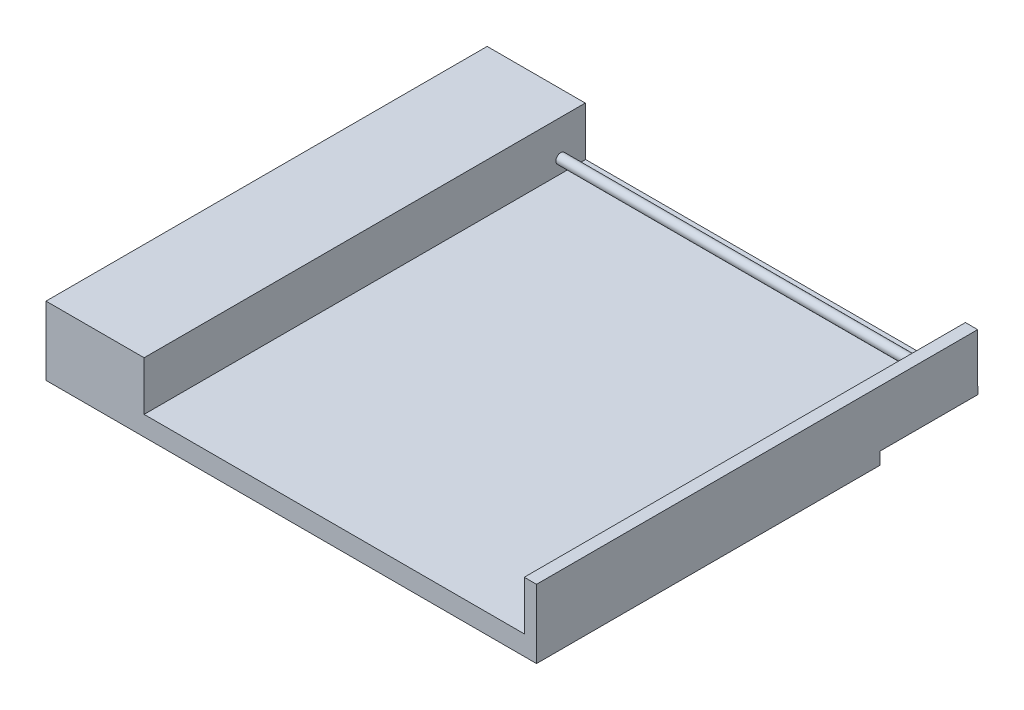
ISO-10303-21;
HEADER;
FILE_DESCRIPTION(('STEP AP214'),'2;1');
FILE_NAME('part.step','',(''),(''),'','','');
FILE_SCHEMA(('AUTOMOTIVE_DESIGN { 1 0 10303 214 1 1 1 1 }'));
ENDSEC;
DATA;
#1=APPLICATION_CONTEXT('core data for automotive mechanical design processes');
#2=APPLICATION_PROTOCOL_DEFINITION('international standard','automotive_design',2000,#1);
#3=PRODUCT_CONTEXT('',#1,'mechanical');
#4=PRODUCT('Part','Part','',(#3));
#5=PRODUCT_RELATED_PRODUCT_CATEGORY('part','',(#4));
#6=PRODUCT_DEFINITION_FORMATION('','',#4);
#7=PRODUCT_DEFINITION_CONTEXT('part definition',#1,'design');
#8=PRODUCT_DEFINITION('design','',#6,#7);
#9=PRODUCT_DEFINITION_SHAPE('','',#8);
#10=(LENGTH_UNIT() NAMED_UNIT(*) SI_UNIT(.MILLI.,.METRE.));
#11=(NAMED_UNIT(*) PLANE_ANGLE_UNIT() SI_UNIT($,.RADIAN.));
#12=(NAMED_UNIT(*) SI_UNIT($,.STERADIAN.) SOLID_ANGLE_UNIT());
#13=UNCERTAINTY_MEASURE_WITH_UNIT(LENGTH_MEASURE(1.E-05),#10,'distance_accuracy_value','');
#14=(GEOMETRIC_REPRESENTATION_CONTEXT(3) GLOBAL_UNCERTAINTY_ASSIGNED_CONTEXT((#13)) GLOBAL_UNIT_ASSIGNED_CONTEXT((#10,
#11,#12)) REPRESENTATION_CONTEXT('',''));
#15=CARTESIAN_POINT('',(0.,0.,0.));
#16=DIRECTION('',(0.,0.,1.));
#17=DIRECTION('',(1.,0.,0.));
#18=AXIS2_PLACEMENT_3D('',#15,#16,#17);
#19=CARTESIAN_POINT('',(-99.9999999999998,23.,-89.8697054914942));
#20=DIRECTION('',(0.,0.,1.));
#21=DIRECTION('',(1.,0.,0.));
#22=AXIS2_PLACEMENT_3D('',#19,#20,#21);
#23=PLANE('',#22);
#24=DIRECTION('',(-1.,0.,0.));
#25=VECTOR('',#24,1.);
#26=CARTESIAN_POINT('',(-99.9999999999998,23.,-89.8697054914942));
#27=LINE('',#26,#25);
#28=CARTESIAN_POINT('',(-59.9999999999998,23.,-89.8697054914942));
#29=VERTEX_POINT('',#28);
#30=CARTESIAN_POINT('',(-99.9999999999998,23.,-89.8697054914942));
#31=VERTEX_POINT('',#30);
#32=EDGE_CURVE('E150',#29,#31,#27,.T.);
#33=ORIENTED_EDGE('',*,*,#32,.F.);
#34=DIRECTION('',(0.,1.,0.));
#35=VECTOR('',#34,1.);
#36=CARTESIAN_POINT('',(-59.9999999999998,3.,-89.8697054914942));
#37=LINE('',#36,#35);
#38=CARTESIAN_POINT('',(-59.9999999999998,3.,-89.8697054914942));
#39=VERTEX_POINT('',#38);
#40=EDGE_CURVE('E133',#39,#29,#37,.T.);
#41=ORIENTED_EDGE('',*,*,#40,.F.);
#42=DIRECTION('',(-1.,0.,0.));
#43=VECTOR('',#42,1.);
#44=CARTESIAN_POINT('',(-99.9999999999998,3.,-89.8697054914942));
#45=LINE('',#44,#43);
#46=CARTESIAN_POINT('',(-99.9999999999998,3.,-89.8697054914942));
#47=VERTEX_POINT('',#46);
#48=EDGE_CURVE('E173',#39,#47,#45,.T.);
#49=ORIENTED_EDGE('',*,*,#48,.T.);
#50=DIRECTION('',(0.,-1.,0.));
#51=VECTOR('',#50,1.);
#52=CARTESIAN_POINT('',(-99.9999999999998,23.,-89.8697054914942));
#53=LINE('',#52,#51);
#54=EDGE_CURVE('E158',#31,#47,#53,.T.);
#55=ORIENTED_EDGE('',*,*,#54,.F.);
#56=EDGE_LOOP('',(#33,#41,#49,#55));
#57=FACE_BOUND('',#56,.T.);
#58=ADVANCED_FACE('F43',(#57),#23,.F.);
#59=CARTESIAN_POINT('',(0.,23.,0.));
#60=DIRECTION('',(0.,-1.,0.));
#61=DIRECTION('',(0.,0.,-1.));
#62=AXIS2_PLACEMENT_3D('',#59,#60,#61);
#63=PLANE('',#62);
#64=DIRECTION('',(1.,0.,0.));
#65=VECTOR('',#64,1.);
#66=CARTESIAN_POINT('',(-99.9999999999998,23.,89.9999999999995));
#67=LINE('',#66,#65);
#68=CARTESIAN_POINT('',(-99.9999999999998,23.,89.9999999999995));
#69=VERTEX_POINT('',#68);
#70=CARTESIAN_POINT('',(-59.9999999999998,23.,89.9999999999995));
#71=VERTEX_POINT('',#70);
#72=EDGE_CURVE('E153',#69,#71,#67,.T.);
#73=ORIENTED_EDGE('',*,*,#72,.T.);
#74=DIRECTION('',(0.,0.,-1.));
#75=VECTOR('',#74,1.);
#76=CARTESIAN_POINT('',(-59.9999999999998,23.,246.284996080877));
#77=LINE('',#76,#75);
#78=EDGE_CURVE('E136',#71,#29,#77,.T.);
#79=ORIENTED_EDGE('',*,*,#78,.T.);
#80=ORIENTED_EDGE('',*,*,#32,.T.);
#81=DIRECTION('',(0.,0.,1.));
#82=VECTOR('',#81,1.);
#83=CARTESIAN_POINT('',(-99.9999999999998,23.,89.9999999999995));
#84=LINE('',#83,#82);
#85=EDGE_CURVE('E172',#31,#69,#84,.T.);
#86=ORIENTED_EDGE('',*,*,#85,.T.);
#87=EDGE_LOOP('',(#73,#79,#80,#86));
#88=FACE_BOUND('',#87,.T.);
#89=ADVANCED_FACE('F148',(#88),#63,.F.);
#90=CARTESIAN_POINT('',(0.,3.,0.));
#91=DIRECTION('',(0.,-1.,0.));
#92=DIRECTION('',(0.,0.,-1.));
#93=AXIS2_PLACEMENT_3D('',#90,#91,#92);
#94=PLANE('',#93);
#95=CARTESIAN_POINT('',(100.,3.,-89.8697054914941));
#96=VERTEX_POINT('',#95);
#97=CARTESIAN_POINT('',(95.0000000000002,3.,-89.8697054914942));
#98=VERTEX_POINT('',#97);
#99=EDGE_CURVE('E67',#96,#98,#45,.T.);
#100=ORIENTED_EDGE('',*,*,#99,.F.);
#101=DIRECTION('',(0.,0.,-1.));
#102=VECTOR('',#101,1.);
#103=CARTESIAN_POINT('',(100.,3.,89.9999999999995));
#104=LINE('',#103,#102);
#105=CARTESIAN_POINT('',(100.,3.,-90.0000000000004));
#106=VERTEX_POINT('',#105);
#107=EDGE_CURVE('E208',#96,#106,#104,.T.);
#108=ORIENTED_EDGE('',*,*,#107,.T.);
#109=DIRECTION('',(-1.,0.,0.));
#110=VECTOR('',#109,1.);
#111=CARTESIAN_POINT('',(-99.9999999999998,3.,-90.0000000000004));
#112=LINE('',#111,#110);
#113=CARTESIAN_POINT('',(-99.9999999999998,3.,-90.0000000000004));
#114=VERTEX_POINT('',#113);
#115=EDGE_CURVE('E211',#106,#114,#112,.T.);
#116=ORIENTED_EDGE('',*,*,#115,.T.);
#117=DIRECTION('',(0.,0.,1.));
#118=VECTOR('',#117,1.);
#119=CARTESIAN_POINT('',(-99.9999999999998,3.,89.9999999999995));
#120=LINE('',#119,#118);
#121=EDGE_CURVE('E215',#114,#47,#120,.T.);
#122=ORIENTED_EDGE('',*,*,#121,.T.);
#123=ORIENTED_EDGE('',*,*,#48,.F.);
#124=DIRECTION('',(0.,0.,-1.));
#125=VECTOR('',#124,1.);
#126=CARTESIAN_POINT('',(-59.9999999999998,3.,246.284996080877));
#127=LINE('',#126,#125);
#128=CARTESIAN_POINT('',(-59.9999999999998,3.,89.9999999999995));
#129=VERTEX_POINT('',#128);
#130=EDGE_CURVE('E139',#129,#39,#127,.T.);
#131=ORIENTED_EDGE('',*,*,#130,.F.);
#132=DIRECTION('',(1.,0.,0.));
#133=VECTOR('',#132,1.);
#134=CARTESIAN_POINT('',(95.0000000000002,3.,89.9999999999995));
#135=LINE('',#134,#133);
#136=CARTESIAN_POINT('',(95.0000000000002,3.,89.9999999999995));
#137=VERTEX_POINT('',#136);
#138=EDGE_CURVE('E297',#129,#137,#135,.T.);
#139=ORIENTED_EDGE('',*,*,#138,.T.);
#140=DIRECTION('',(0.,0.,-1.));
#141=VECTOR('',#140,1.);
#142=CARTESIAN_POINT('',(95.0000000000002,3.,246.284996080877));
#143=LINE('',#142,#141);
#144=EDGE_CURVE('E307',#137,#98,#143,.T.);
#145=ORIENTED_EDGE('',*,*,#144,.T.);
#146=EDGE_LOOP('',(#100,#108,#116,#122,#123,#131,#139,#145));
#147=FACE_BOUND('',#146,.T.);
#148=ADVANCED_FACE('F264',(#147),#94,.F.);
#149=CARTESIAN_POINT('',(100.,3.,89.9999999999995));
#150=DIRECTION('',(-1.,0.,0.));
#151=DIRECTION('',(0.,0.,1.));
#152=AXIS2_PLACEMENT_3D('',#149,#150,#151);
#153=PLANE('',#152);
#154=DIRECTION('',(0.,-1.,0.));
#155=VECTOR('',#154,1.);
#156=CARTESIAN_POINT('',(100.,3.,89.9999999999995));
#157=LINE('',#156,#155);
#158=CARTESIAN_POINT('',(100.,23.,89.9999999999995));
#159=VERTEX_POINT('',#158);
#160=CARTESIAN_POINT('',(100.,-5.,89.9999999999995));
#161=VERTEX_POINT('',#160);
#162=EDGE_CURVE('E219',#159,#161,#157,.T.);
#163=ORIENTED_EDGE('',*,*,#162,.T.);
#164=DIRECTION('',(0.,0.,1.));
#165=VECTOR('',#164,1.);
#166=CARTESIAN_POINT('',(100.,-5.,89.9999999999995));
#167=LINE('',#166,#165);
#168=CARTESIAN_POINT('',(100.,-5.,-50.0000000000005));
#169=VERTEX_POINT('',#168);
#170=EDGE_CURVE('E188',#169,#161,#167,.T.);
#171=ORIENTED_EDGE('',*,*,#170,.F.);
#172=DIRECTION('',(0.,1.,0.));
#173=VECTOR('',#172,1.);
#174=CARTESIAN_POINT('',(100.,-5.,-50.0000000000005));
#175=LINE('',#174,#173);
#176=CARTESIAN_POINT('',(100.,0.,-50.0000000000005));
#177=VERTEX_POINT('',#176);
#178=EDGE_CURVE('E196',#169,#177,#175,.T.);
#179=ORIENTED_EDGE('',*,*,#178,.T.);
#180=DIRECTION('',(0.,0.,-1.));
#181=VECTOR('',#180,1.);
#182=CARTESIAN_POINT('',(100.,0.,89.9999999999995));
#183=LINE('',#182,#181);
#184=CARTESIAN_POINT('',(100.,0.,-90.0000000000004));
#185=VERTEX_POINT('',#184);
#186=EDGE_CURVE('E207',#177,#185,#183,.T.);
#187=ORIENTED_EDGE('',*,*,#186,.T.);
#188=DIRECTION('',(0.,-1.,0.));
#189=VECTOR('',#188,1.);
#190=CARTESIAN_POINT('',(100.,3.,-90.0000000000004));
#191=LINE('',#190,#189);
#192=EDGE_CURVE('E237',#106,#185,#191,.T.);
#193=ORIENTED_EDGE('',*,*,#192,.F.);
#194=ORIENTED_EDGE('',*,*,#107,.F.);
#195=DIRECTION('',(0.,-1.,0.));
#196=VECTOR('',#195,1.);
#197=CARTESIAN_POINT('',(100.,23.,-89.8697054914942));
#198=LINE('',#197,#196);
#199=CARTESIAN_POINT('',(100.,23.,-89.8697054914942));
#200=VERTEX_POINT('',#199);
#201=EDGE_CURVE('E176',#200,#96,#198,.T.);
#202=ORIENTED_EDGE('',*,*,#201,.F.);
#203=DIRECTION('',(0.,0.,-1.));
#204=VECTOR('',#203,1.);
#205=CARTESIAN_POINT('',(100.,23.,89.9999999999995));
#206=LINE('',#205,#204);
#207=EDGE_CURVE('E162',#159,#200,#206,.T.);
#208=ORIENTED_EDGE('',*,*,#207,.F.);
#209=EDGE_LOOP('',(#163,#171,#179,#187,#193,#194,#202,#208));
#210=FACE_BOUND('',#209,.T.);
#211=ADVANCED_FACE('F45',(#210),#153,.F.);
#212=CARTESIAN_POINT('',(-99.9999999999998,3.,-90.0000000000004));
#213=DIRECTION('',(0.,0.,1.));
#214=DIRECTION('',(1.,0.,0.));
#215=AXIS2_PLACEMENT_3D('',#212,#213,#214);
#216=PLANE('',#215);
#217=DIRECTION('',(-1.,0.,0.));
#218=VECTOR('',#217,1.);
#219=CARTESIAN_POINT('',(-99.9999999999998,0.,-90.0000000000004));
#220=LINE('',#219,#218);
#221=CARTESIAN_POINT('',(-99.9999999999998,0.,-90.0000000000004));
#222=VERTEX_POINT('',#221);
#223=EDGE_CURVE('E222',#185,#222,#220,.T.);
#224=ORIENTED_EDGE('',*,*,#223,.T.);
#225=DIRECTION('',(0.,-1.,0.));
#226=VECTOR('',#225,1.);
#227=CARTESIAN_POINT('',(-99.9999999999998,3.,-90.0000000000004));
#228=LINE('',#227,#226);
#229=EDGE_CURVE('E233',#114,#222,#228,.T.);
#230=ORIENTED_EDGE('',*,*,#229,.F.);
#231=ORIENTED_EDGE('',*,*,#115,.F.);
#232=ORIENTED_EDGE('',*,*,#192,.T.);
#233=EDGE_LOOP('',(#224,#230,#231,#232));
#234=FACE_BOUND('',#233,.T.);
#235=ADVANCED_FACE('F287',(#234),#216,.F.);
#236=CARTESIAN_POINT('',(-99.9999999999998,3.,89.9999999999995));
#237=DIRECTION('',(1.,0.,0.));
#238=DIRECTION('',(0.,0.,-1.));
#239=AXIS2_PLACEMENT_3D('',#236,#237,#238);
#240=PLANE('',#239);
#241=DIRECTION('',(0.,0.,1.));
#242=VECTOR('',#241,1.);
#243=CARTESIAN_POINT('',(-99.9999999999998,0.,89.9999999999995));
#244=LINE('',#243,#242);
#245=CARTESIAN_POINT('',(-99.9999999999998,0.,-50.0000000000004));
#246=VERTEX_POINT('',#245);
#247=EDGE_CURVE('E212',#222,#246,#244,.T.);
#248=ORIENTED_EDGE('',*,*,#247,.T.);
#249=DIRECTION('',(0.,1.,0.));
#250=VECTOR('',#249,1.);
#251=CARTESIAN_POINT('',(-99.9999999999998,-5.,-50.0000000000005));
#252=LINE('',#251,#250);
#253=CARTESIAN_POINT('',(-99.9999999999998,-5.,-50.0000000000005));
#254=VERTEX_POINT('',#253);
#255=EDGE_CURVE('E203',#254,#246,#252,.T.);
#256=ORIENTED_EDGE('',*,*,#255,.F.);
#257=DIRECTION('',(0.,0.,-1.));
#258=VECTOR('',#257,1.);
#259=CARTESIAN_POINT('',(-99.9999999999998,-5.,89.9999999999995));
#260=LINE('',#259,#258);
#261=CARTESIAN_POINT('',(-99.9999999999998,-5.,89.9999999999995));
#262=VERTEX_POINT('',#261);
#263=EDGE_CURVE('E181',#262,#254,#260,.T.);
#264=ORIENTED_EDGE('',*,*,#263,.F.);
#265=DIRECTION('',(0.,-1.,0.));
#266=VECTOR('',#265,1.);
#267=CARTESIAN_POINT('',(-99.9999999999998,3.,89.9999999999995));
#268=LINE('',#267,#266);
#269=EDGE_CURVE('E230',#69,#262,#268,.T.);
#270=ORIENTED_EDGE('',*,*,#269,.F.);
#271=ORIENTED_EDGE('',*,*,#85,.F.);
#272=ORIENTED_EDGE('',*,*,#54,.T.);
#273=ORIENTED_EDGE('',*,*,#121,.F.);
#274=ORIENTED_EDGE('',*,*,#229,.T.);
#275=EDGE_LOOP('',(#248,#256,#264,#270,#271,#272,#273,#274));
#276=FACE_BOUND('',#275,.T.);
#277=ADVANCED_FACE('F292',(#276),#240,.F.);
#278=CARTESIAN_POINT('',(-99.9999999999998,3.,89.9999999999995));
#279=DIRECTION('',(0.,0.,-1.));
#280=DIRECTION('',(-1.,0.,0.));
#281=AXIS2_PLACEMENT_3D('',#278,#279,#280);
#282=PLANE('',#281);
#283=ORIENTED_EDGE('',*,*,#138,.F.);
#284=DIRECTION('',(0.,-1.,0.));
#285=VECTOR('',#284,1.);
#286=CARTESIAN_POINT('',(-59.9999999999998,3.,89.9999999999995));
#287=LINE('',#286,#285);
#288=EDGE_CURVE('E295',#71,#129,#287,.T.);
#289=ORIENTED_EDGE('',*,*,#288,.F.);
#290=ORIENTED_EDGE('',*,*,#72,.F.);
#291=ORIENTED_EDGE('',*,*,#269,.T.);
#292=DIRECTION('',(-1.,0.,0.));
#293=VECTOR('',#292,1.);
#294=CARTESIAN_POINT('',(-99.9999999999998,-5.,89.9999999999995));
#295=LINE('',#294,#293);
#296=EDGE_CURVE('E192',#161,#262,#295,.T.);
#297=ORIENTED_EDGE('',*,*,#296,.F.);
#298=ORIENTED_EDGE('',*,*,#162,.F.);
#299=CARTESIAN_POINT('',(95.0000000000002,23.,89.9999999999995));
#300=VERTEX_POINT('',#299);
#301=EDGE_CURVE('E313',#300,#159,#67,.T.);
#302=ORIENTED_EDGE('',*,*,#301,.F.);
#303=DIRECTION('',(0.,1.,0.));
#304=VECTOR('',#303,1.);
#305=CARTESIAN_POINT('',(95.0000000000002,3.,89.9999999999995));
#306=LINE('',#305,#304);
#307=EDGE_CURVE('E59',#137,#300,#306,.T.);
#308=ORIENTED_EDGE('',*,*,#307,.F.);
#309=EDGE_LOOP('',(#283,#289,#290,#291,#297,#298,#302,#308));
#310=FACE_BOUND('',#309,.T.);
#311=ADVANCED_FACE('F320',(#310),#282,.F.);
#312=CARTESIAN_POINT('',(0.,0.,0.));
#313=DIRECTION('',(0.,-1.,0.));
#314=DIRECTION('',(0.,0.,-1.));
#315=AXIS2_PLACEMENT_3D('',#312,#313,#314);
#316=PLANE('',#315);
#317=DIRECTION('',(1.,0.,0.));
#318=VECTOR('',#317,1.);
#319=CARTESIAN_POINT('',(-99.9999999999998,0.,-50.0000000000005));
#320=LINE('',#319,#318);
#321=EDGE_CURVE('E180',#246,#177,#320,.T.);
#322=ORIENTED_EDGE('',*,*,#321,.F.);
#323=ORIENTED_EDGE('',*,*,#247,.F.);
#324=ORIENTED_EDGE('',*,*,#223,.F.);
#325=ORIENTED_EDGE('',*,*,#186,.F.);
#326=EDGE_LOOP('',(#322,#323,#324,#325));
#327=FACE_BOUND('',#326,.T.);
#328=ADVANCED_FACE('F327',(#327),#316,.T.);
#329=CARTESIAN_POINT('',(-99.9999999999998,-5.,-50.0000000000005));
#330=DIRECTION('',(0.,0.,1.));
#331=DIRECTION('',(1.,0.,0.));
#332=AXIS2_PLACEMENT_3D('',#329,#330,#331);
#333=PLANE('',#332);
#334=ORIENTED_EDGE('',*,*,#321,.T.);
#335=ORIENTED_EDGE('',*,*,#178,.F.);
#336=DIRECTION('',(1.,0.,0.));
#337=VECTOR('',#336,1.);
#338=CARTESIAN_POINT('',(-99.9999999999998,-5.,-50.0000000000005));
#339=LINE('',#338,#337);
#340=EDGE_CURVE('E185',#254,#169,#339,.T.);
#341=ORIENTED_EDGE('',*,*,#340,.F.);
#342=ORIENTED_EDGE('',*,*,#255,.T.);
#343=EDGE_LOOP('',(#334,#335,#341,#342));
#344=FACE_BOUND('',#343,.T.);
#345=ADVANCED_FACE('F275',(#344),#333,.F.);
#346=CARTESIAN_POINT('',(0.,-5.,0.));
#347=DIRECTION('',(0.,-1.,0.));
#348=DIRECTION('',(0.,0.,-1.));
#349=AXIS2_PLACEMENT_3D('',#346,#347,#348);
#350=PLANE('',#349);
#351=ORIENTED_EDGE('',*,*,#263,.T.);
#352=ORIENTED_EDGE('',*,*,#340,.T.);
#353=ORIENTED_EDGE('',*,*,#170,.T.);
#354=ORIENTED_EDGE('',*,*,#296,.T.);
#355=EDGE_LOOP('',(#351,#352,#353,#354));
#356=FACE_BOUND('',#355,.T.);
#357=ADVANCED_FACE('F268',(#356),#350,.T.);
#358=ORIENTED_EDGE('',*,*,#99,.T.);
#359=DIRECTION('',(0.,-1.,0.));
#360=VECTOR('',#359,1.);
#361=CARTESIAN_POINT('',(95.0000000000002,3.,-89.8697054914942));
#362=LINE('',#361,#360);
#363=CARTESIAN_POINT('',(95.0000000000002,23.,-89.8697054914942));
#364=VERTEX_POINT('',#363);
#365=EDGE_CURVE('E144',#364,#98,#362,.T.);
#366=ORIENTED_EDGE('',*,*,#365,.F.);
#367=EDGE_CURVE('E161',#200,#364,#27,.T.);
#368=ORIENTED_EDGE('',*,*,#367,.F.);
#369=ORIENTED_EDGE('',*,*,#201,.T.);
#370=EDGE_LOOP('',(#358,#366,#368,#369));
#371=FACE_BOUND('',#370,.T.);
#372=ADVANCED_FACE('F260',(#371),#23,.F.);
#373=ORIENTED_EDGE('',*,*,#367,.T.);
#374=DIRECTION('',(0.,0.,-1.));
#375=VECTOR('',#374,1.);
#376=CARTESIAN_POINT('',(95.0000000000002,23.,246.284996080877));
#377=LINE('',#376,#375);
#378=EDGE_CURVE('E155',#300,#364,#377,.T.);
#379=ORIENTED_EDGE('',*,*,#378,.F.);
#380=ORIENTED_EDGE('',*,*,#301,.T.);
#381=ORIENTED_EDGE('',*,*,#207,.T.);
#382=EDGE_LOOP('',(#373,#379,#380,#381));
#383=FACE_BOUND('',#382,.T.);
#384=ADVANCED_FACE('F255',(#383),#63,.F.);
#385=CARTESIAN_POINT('',(-59.9999999999998,3.,246.284996080877));
#386=DIRECTION('',(-1.,0.,0.));
#387=DIRECTION('',(0.,0.,1.));
#388=AXIS2_PLACEMENT_3D('',#385,#386,#387);
#389=PLANE('',#388);
#390=CARTESIAN_POINT('',(-59.9999999999998,8.5,-79.8697054914942));
#391=DIRECTION('',(-1.,0.,0.));
#392=DIRECTION('',(0.,0.,1.));
#393=AXIS2_PLACEMENT_3D('',#390,#391,#392);
#394=CIRCLE('',#393,2.);
#395=CARTESIAN_POINT('',(-59.9999999999998,8.5,-77.8697054914942));
#396=VERTEX_POINT('',#395);
#397=EDGE_CURVE('E11',#396,#396,#394,.F.);
#398=ORIENTED_EDGE('',*,*,#397,.F.);
#399=EDGE_LOOP('',(#398));
#400=FACE_BOUND('',#399,.T.);
#401=ORIENTED_EDGE('',*,*,#288,.T.);
#402=ORIENTED_EDGE('',*,*,#130,.T.);
#403=ORIENTED_EDGE('',*,*,#40,.T.);
#404=ORIENTED_EDGE('',*,*,#78,.F.);
#405=EDGE_LOOP('',(#401,#402,#403,#404));
#406=FACE_BOUND('',#405,.T.);
#407=ADVANCED_FACE('F135',(#400,#406),#389,.F.);
#408=CARTESIAN_POINT('',(95.0000000000002,3.,246.284996080877));
#409=DIRECTION('',(1.,0.,0.));
#410=DIRECTION('',(0.,0.,-1.));
#411=AXIS2_PLACEMENT_3D('',#408,#409,#410);
#412=PLANE('',#411);
#413=CARTESIAN_POINT('',(95.0000000000002,8.5,-79.8697054914942));
#414=DIRECTION('',(1.,0.,0.));
#415=DIRECTION('',(0.,0.,-1.));
#416=AXIS2_PLACEMENT_3D('',#413,#414,#415);
#417=CIRCLE('',#416,2.);
#418=CARTESIAN_POINT('',(95.0000000000002,8.5,-81.8697054914942));
#419=VERTEX_POINT('',#418);
#420=EDGE_CURVE('E52',#419,#419,#417,.F.);
#421=ORIENTED_EDGE('',*,*,#420,.F.);
#422=EDGE_LOOP('',(#421));
#423=FACE_BOUND('',#422,.T.);
#424=ORIENTED_EDGE('',*,*,#307,.T.);
#425=ORIENTED_EDGE('',*,*,#378,.T.);
#426=ORIENTED_EDGE('',*,*,#365,.T.);
#427=ORIENTED_EDGE('',*,*,#144,.F.);
#428=EDGE_LOOP('',(#424,#425,#426,#427));
#429=FACE_BOUND('',#428,.T.);
#430=ADVANCED_FACE('F247',(#423,#429),#412,.F.);
#431=CARTESIAN_POINT('',(-65.6568542494922,8.5,-79.8697054914942));
#432=DIRECTION('',(1.,0.,0.));
#433=DIRECTION('',(0.,0.,-1.));
#434=AXIS2_PLACEMENT_3D('',#431,#432,#433);
#435=CYLINDRICAL_SURFACE('',#434,2.);
#436=ORIENTED_EDGE('',*,*,#420,.T.);
#437=EDGE_LOOP('',(#436));
#438=FACE_BOUND('',#437,.T.);
#439=ORIENTED_EDGE('',*,*,#397,.T.);
#440=EDGE_LOOP('',(#439));
#441=FACE_BOUND('',#440,.T.);
#442=ADVANCED_FACE('F244',(#438,#441),#435,.T.);
#443=CLOSED_SHELL('',(#58,#89,#148,#211,#235,#277,#311,#328,#345,#357,#372,#384,#407,#430,#442));
#444=MANIFOLD_SOLID_BREP('B2',#443);
#445=ADVANCED_BREP_SHAPE_REPRESENTATION('',(#18,#444),#14);
#446=SHAPE_DEFINITION_REPRESENTATION(#9,#445);
ENDSEC;
END-ISO-10303-21;
